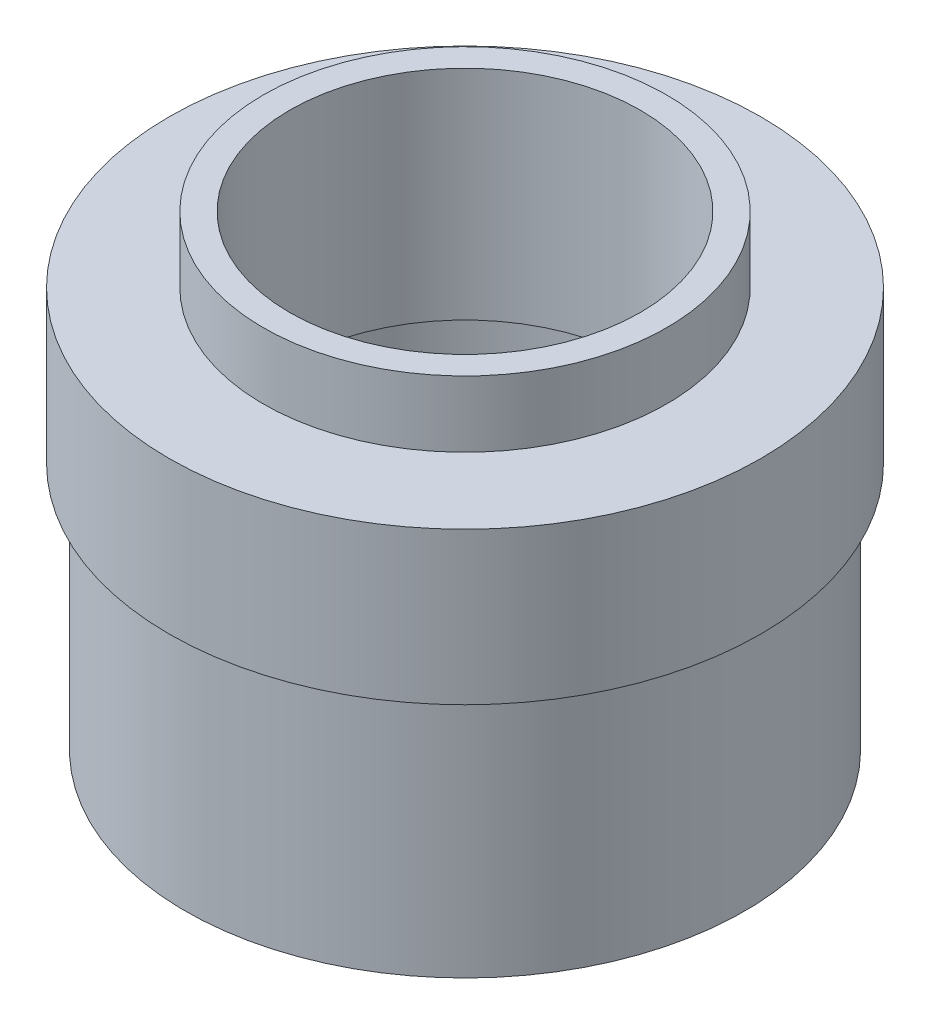
ISO-10303-21;
HEADER;
FILE_DESCRIPTION(('STEP AP214'),'2;1');
FILE_NAME('part.step','',(''),(''),'','','');
FILE_SCHEMA(('AUTOMOTIVE_DESIGN { 1 0 10303 214 1 1 1 1 }'));
ENDSEC;
DATA;
#1=APPLICATION_CONTEXT('core data for automotive mechanical design processes');
#2=APPLICATION_PROTOCOL_DEFINITION('international standard','automotive_design',2000,#1);
#3=PRODUCT_CONTEXT('',#1,'mechanical');
#4=PRODUCT('Part','Part','',(#3));
#5=PRODUCT_RELATED_PRODUCT_CATEGORY('part','',(#4));
#6=PRODUCT_DEFINITION_FORMATION('','',#4);
#7=PRODUCT_DEFINITION_CONTEXT('part definition',#1,'design');
#8=PRODUCT_DEFINITION('design','',#6,#7);
#9=PRODUCT_DEFINITION_SHAPE('','',#8);
#10=(LENGTH_UNIT() NAMED_UNIT(*) SI_UNIT(.MILLI.,.METRE.));
#11=(NAMED_UNIT(*) PLANE_ANGLE_UNIT() SI_UNIT($,.RADIAN.));
#12=(NAMED_UNIT(*) SI_UNIT($,.STERADIAN.) SOLID_ANGLE_UNIT());
#13=UNCERTAINTY_MEASURE_WITH_UNIT(LENGTH_MEASURE(1.E-05),#10,'distance_accuracy_value','');
#14=(GEOMETRIC_REPRESENTATION_CONTEXT(3) GLOBAL_UNCERTAINTY_ASSIGNED_CONTEXT((#13)) GLOBAL_UNIT_ASSIGNED_CONTEXT((#10,
#11,#12)) REPRESENTATION_CONTEXT('',''));
#15=CARTESIAN_POINT('',(0.,0.,0.));
#16=DIRECTION('',(0.,0.,1.));
#17=DIRECTION('',(1.,0.,0.));
#18=AXIS2_PLACEMENT_3D('',#15,#16,#17);
#19=CARTESIAN_POINT('',(0.,29.21,0.));
#20=DIRECTION('',(0.,-1.,0.));
#21=DIRECTION('',(1.,0.,0.));
#22=AXIS2_PLACEMENT_3D('',#19,#20,#21);
#23=PLANE('',#22);
#24=CARTESIAN_POINT('',(0.,29.21,0.));
#25=DIRECTION('',(0.,1.,0.));
#26=DIRECTION('',(0.,0.,1.));
#27=AXIS2_PLACEMENT_3D('',#24,#25,#26);
#28=CIRCLE('',#27,10.9855);
#29=CARTESIAN_POINT('',(0.,29.21,10.9855));
#30=VERTEX_POINT('',#29);
#31=EDGE_CURVE('E63',#30,#30,#28,.T.);
#32=ORIENTED_EDGE('',*,*,#31,.F.);
#33=EDGE_LOOP('',(#32));
#34=FACE_BOUND('',#33,.T.);
#35=CARTESIAN_POINT('',(0.,29.21,0.));
#36=DIRECTION('',(0.,1.,0.));
#37=DIRECTION('',(-1.,0.,0.));
#38=AXIS2_PLACEMENT_3D('',#35,#36,#37);
#39=CIRCLE('',#38,12.6365);
#40=CARTESIAN_POINT('',(-12.6365,29.21,0.));
#41=VERTEX_POINT('',#40);
#42=EDGE_CURVE('E10',#41,#41,#39,.T.);
#43=ORIENTED_EDGE('',*,*,#42,.T.);
#44=EDGE_LOOP('',(#43));
#45=FACE_BOUND('',#44,.T.);
#46=ADVANCED_FACE('F32',(#34,#45),#23,.F.);
#47=CARTESIAN_POINT('',(0.,29.21,0.));
#48=DIRECTION('',(0.,1.,0.));
#49=DIRECTION('',(-1.,0.,0.));
#50=AXIS2_PLACEMENT_3D('',#47,#48,#49);
#51=CYLINDRICAL_SURFACE('',#50,12.6365);
#52=ORIENTED_EDGE('',*,*,#42,.F.);
#53=EDGE_LOOP('',(#52));
#54=FACE_BOUND('',#53,.T.);
#55=CARTESIAN_POINT('',(0.,25.0698,0.));
#56=DIRECTION('',(0.,1.,0.));
#57=DIRECTION('',(-1.,0.,0.));
#58=AXIS2_PLACEMENT_3D('',#55,#56,#57);
#59=CIRCLE('',#58,12.6365);
#60=CARTESIAN_POINT('',(-12.6365,25.0698,0.));
#61=VERTEX_POINT('',#60);
#62=EDGE_CURVE('E39',#61,#61,#59,.T.);
#63=ORIENTED_EDGE('',*,*,#62,.T.);
#64=EDGE_LOOP('',(#63));
#65=FACE_BOUND('',#64,.T.);
#66=ADVANCED_FACE('F110',(#54,#65),#51,.T.);
#67=CARTESIAN_POINT('',(0.,25.0698,0.));
#68=DIRECTION('',(0.,-1.,0.));
#69=DIRECTION('',(1.,0.,0.));
#70=AXIS2_PLACEMENT_3D('',#67,#68,#69);
#71=PLANE('',#70);
#72=ORIENTED_EDGE('',*,*,#62,.F.);
#73=EDGE_LOOP('',(#72));
#74=FACE_BOUND('',#73,.T.);
#75=CARTESIAN_POINT('',(0.,25.0698,0.));
#76=DIRECTION('',(0.,1.,0.));
#77=DIRECTION('',(-1.,0.,0.));
#78=AXIS2_PLACEMENT_3D('',#75,#76,#77);
#79=CIRCLE('',#78,18.542);
#80=CARTESIAN_POINT('',(-18.542,25.0698,0.));
#81=VERTEX_POINT('',#80);
#82=EDGE_CURVE('E43',#81,#81,#79,.T.);
#83=ORIENTED_EDGE('',*,*,#82,.T.);
#84=EDGE_LOOP('',(#83));
#85=FACE_BOUND('',#84,.T.);
#86=ADVANCED_FACE('F105',(#74,#85),#71,.F.);
#87=CARTESIAN_POINT('',(0.,29.21,0.));
#88=DIRECTION('',(0.,1.,0.));
#89=DIRECTION('',(-1.,0.,0.));
#90=AXIS2_PLACEMENT_3D('',#87,#88,#89);
#91=CYLINDRICAL_SURFACE('',#90,18.542);
#92=CARTESIAN_POINT('',(0.,15.5448,0.));
#93=DIRECTION('',(0.,1.,0.));
#94=DIRECTION('',(-1.,0.,0.));
#95=AXIS2_PLACEMENT_3D('',#92,#93,#94);
#96=CIRCLE('',#95,18.542);
#97=CARTESIAN_POINT('',(-18.542,15.5448,0.));
#98=VERTEX_POINT('',#97);
#99=EDGE_CURVE('E48',#98,#98,#96,.T.);
#100=ORIENTED_EDGE('',*,*,#99,.T.);
#101=EDGE_LOOP('',(#100));
#102=FACE_BOUND('',#101,.T.);
#103=ORIENTED_EDGE('',*,*,#82,.F.);
#104=EDGE_LOOP('',(#103));
#105=FACE_BOUND('',#104,.T.);
#106=ADVANCED_FACE('F99',(#102,#105),#91,.T.);
#107=CARTESIAN_POINT('',(-1.25895572097895E-13,15.5448,0.));
#108=DIRECTION('',(0.,-1.,0.));
#109=DIRECTION('',(1.,0.,0.));
#110=AXIS2_PLACEMENT_3D('',#107,#108,#109);
#111=PLANE('',#110);
#112=CARTESIAN_POINT('',(0.,15.5448,0.));
#113=DIRECTION('',(0.,1.,0.));
#114=DIRECTION('',(-1.,0.,0.));
#115=AXIS2_PLACEMENT_3D('',#112,#113,#114);
#116=CIRCLE('',#115,17.526);
#117=CARTESIAN_POINT('',(-17.526,15.5448,0.));
#118=VERTEX_POINT('',#117);
#119=EDGE_CURVE('E51',#118,#118,#116,.T.);
#120=ORIENTED_EDGE('',*,*,#119,.T.);
#121=EDGE_LOOP('',(#120));
#122=FACE_BOUND('',#121,.T.);
#123=ORIENTED_EDGE('',*,*,#99,.F.);
#124=EDGE_LOOP('',(#123));
#125=FACE_BOUND('',#124,.T.);
#126=ADVANCED_FACE('F93',(#122,#125),#111,.T.);
#127=CARTESIAN_POINT('',(0.,29.21,0.));
#128=DIRECTION('',(0.,1.,0.));
#129=DIRECTION('',(-1.,0.,0.));
#130=AXIS2_PLACEMENT_3D('',#127,#128,#129);
#131=CYLINDRICAL_SURFACE('',#130,17.526);
#132=CARTESIAN_POINT('',(0.,0.,0.));
#133=DIRECTION('',(0.,1.,0.));
#134=DIRECTION('',(-1.,0.,0.));
#135=AXIS2_PLACEMENT_3D('',#132,#133,#134);
#136=CIRCLE('',#135,17.526);
#137=CARTESIAN_POINT('',(-17.526,0.,0.));
#138=VERTEX_POINT('',#137);
#139=EDGE_CURVE('E54',#138,#138,#136,.T.);
#140=ORIENTED_EDGE('',*,*,#139,.T.);
#141=EDGE_LOOP('',(#140));
#142=FACE_BOUND('',#141,.T.);
#143=ORIENTED_EDGE('',*,*,#119,.F.);
#144=EDGE_LOOP('',(#143));
#145=FACE_BOUND('',#144,.T.);
#146=ADVANCED_FACE('F87',(#142,#145),#131,.T.);
#147=CARTESIAN_POINT('',(0.,0.,0.));
#148=DIRECTION('',(0.,-1.,0.));
#149=DIRECTION('',(1.,0.,0.));
#150=AXIS2_PLACEMENT_3D('',#147,#148,#149);
#151=PLANE('',#150);
#152=CARTESIAN_POINT('',(0.,0.,0.));
#153=DIRECTION('',(0.,-1.,0.));
#154=DIRECTION('',(0.,0.,-1.));
#155=AXIS2_PLACEMENT_3D('',#152,#153,#154);
#156=CIRCLE('',#155,12.319);
#157=CARTESIAN_POINT('',(0.,0.,-12.319));
#158=VERTEX_POINT('',#157);
#159=EDGE_CURVE('E60',#158,#158,#156,.T.);
#160=ORIENTED_EDGE('',*,*,#159,.F.);
#161=EDGE_LOOP('',(#160));
#162=FACE_BOUND('',#161,.T.);
#163=ORIENTED_EDGE('',*,*,#139,.F.);
#164=EDGE_LOOP('',(#163));
#165=FACE_BOUND('',#164,.T.);
#166=ADVANCED_FACE('F81',(#162,#165),#151,.T.);
#167=CARTESIAN_POINT('',(0.,50.3881937497483,0.));
#168=DIRECTION('',(0.,-1.,0.));
#169=DIRECTION('',(0.,0.,-1.));
#170=AXIS2_PLACEMENT_3D('',#167,#168,#169);
#171=CYLINDRICAL_SURFACE('',#170,12.319);
#172=CARTESIAN_POINT('',(0.,15.5448,0.));
#173=DIRECTION('',(0.,-1.,0.));
#174=DIRECTION('',(1.,0.,0.));
#175=AXIS2_PLACEMENT_3D('',#172,#173,#174);
#176=CIRCLE('',#175,12.319);
#177=CARTESIAN_POINT('',(12.319,15.5448,0.));
#178=VERTEX_POINT('',#177);
#179=EDGE_CURVE('E57',#178,#178,#176,.F.);
#180=ORIENTED_EDGE('',*,*,#179,.T.);
#181=EDGE_LOOP('',(#180));
#182=FACE_BOUND('',#181,.T.);
#183=ORIENTED_EDGE('',*,*,#159,.T.);
#184=EDGE_LOOP('',(#183));
#185=FACE_BOUND('',#184,.T.);
#186=ADVANCED_FACE('F75',(#182,#185),#171,.F.);
#187=CARTESIAN_POINT('',(-1.25895572097895E-13,15.5448,0.));
#188=DIRECTION('',(0.,-1.,0.));
#189=DIRECTION('',(1.,0.,0.));
#190=AXIS2_PLACEMENT_3D('',#187,#188,#189);
#191=PLANE('',#190);
#192=CARTESIAN_POINT('',(0.,15.5448,0.));
#193=DIRECTION('',(0.,-1.,0.));
#194=DIRECTION('',(1.,0.,0.));
#195=AXIS2_PLACEMENT_3D('',#192,#193,#194);
#196=CIRCLE('',#195,10.9855);
#197=CARTESIAN_POINT('',(10.9855,15.5448,0.));
#198=VERTEX_POINT('',#197);
#199=EDGE_CURVE('E35',#198,#198,#196,.T.);
#200=ORIENTED_EDGE('',*,*,#199,.F.);
#201=EDGE_LOOP('',(#200));
#202=FACE_BOUND('',#201,.T.);
#203=ORIENTED_EDGE('',*,*,#179,.F.);
#204=EDGE_LOOP('',(#203));
#205=FACE_BOUND('',#204,.T.);
#206=ADVANCED_FACE('F72',(#202,#205),#191,.T.);
#207=CARTESIAN_POINT('',(0.,0.,0.));
#208=DIRECTION('',(0.,1.,0.));
#209=DIRECTION('',(0.,0.,1.));
#210=AXIS2_PLACEMENT_3D('',#207,#208,#209);
#211=CYLINDRICAL_SURFACE('',#210,10.9855);
#212=ORIENTED_EDGE('',*,*,#199,.T.);
#213=EDGE_LOOP('',(#212));
#214=FACE_BOUND('',#213,.T.);
#215=ORIENTED_EDGE('',*,*,#31,.T.);
#216=EDGE_LOOP('',(#215));
#217=FACE_BOUND('',#216,.T.);
#218=ADVANCED_FACE('F70',(#214,#217),#211,.F.);
#219=CLOSED_SHELL('',(#46,#66,#86,#106,#126,#146,#166,#186,#206,#218));
#220=MANIFOLD_SOLID_BREP('B2',#219);
#221=ADVANCED_BREP_SHAPE_REPRESENTATION('',(#18,#220),#14);
#222=SHAPE_DEFINITION_REPRESENTATION(#9,#221);
ENDSEC;
END-ISO-10303-21;
